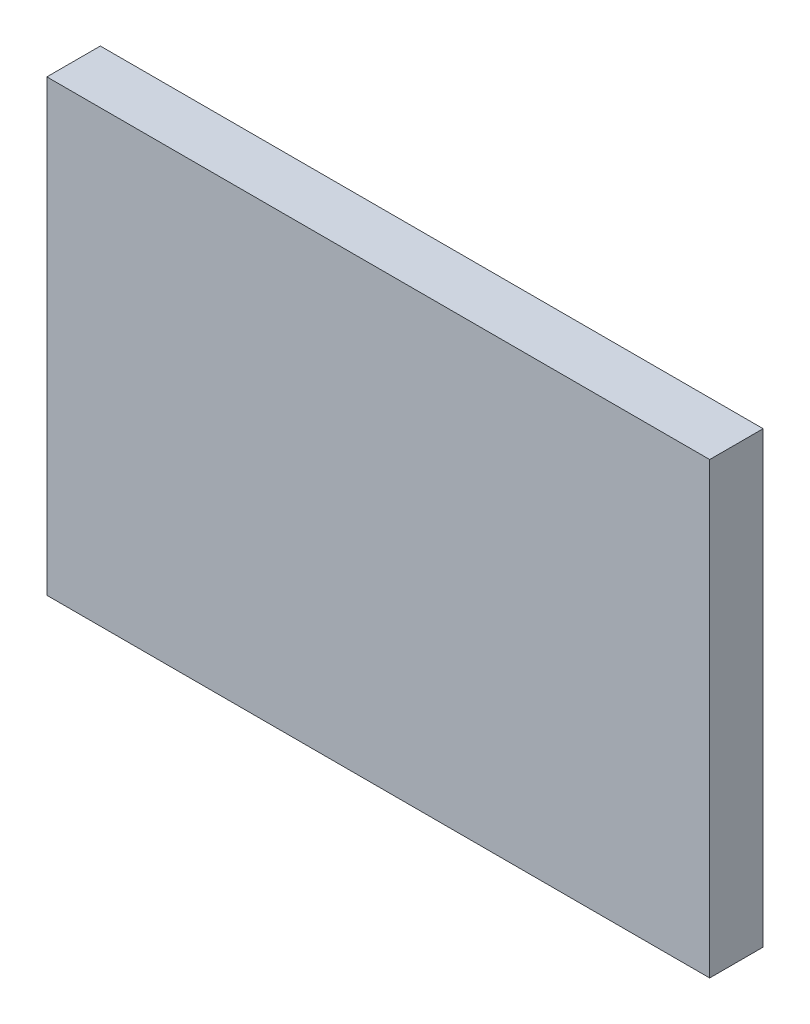
ISO-10303-21;
HEADER;
FILE_DESCRIPTION(('STEP AP214'),'2;1');
FILE_NAME('part.step','',(''),(''),'','','');
FILE_SCHEMA(('AUTOMOTIVE_DESIGN { 1 0 10303 214 1 1 1 1 }'));
ENDSEC;
DATA;
#1=APPLICATION_CONTEXT('core data for automotive mechanical design processes');
#2=APPLICATION_PROTOCOL_DEFINITION('international standard','automotive_design',2000,#1);
#3=PRODUCT_CONTEXT('',#1,'mechanical');
#4=PRODUCT('Part','Part','',(#3));
#5=PRODUCT_RELATED_PRODUCT_CATEGORY('part','',(#4));
#6=PRODUCT_DEFINITION_FORMATION('','',#4);
#7=PRODUCT_DEFINITION_CONTEXT('part definition',#1,'design');
#8=PRODUCT_DEFINITION('design','',#6,#7);
#9=PRODUCT_DEFINITION_SHAPE('','',#8);
#10=(LENGTH_UNIT() NAMED_UNIT(*) SI_UNIT(.MILLI.,.METRE.));
#11=(NAMED_UNIT(*) PLANE_ANGLE_UNIT() SI_UNIT($,.RADIAN.));
#12=(NAMED_UNIT(*) SI_UNIT($,.STERADIAN.) SOLID_ANGLE_UNIT());
#13=UNCERTAINTY_MEASURE_WITH_UNIT(LENGTH_MEASURE(1.E-05),#10,'distance_accuracy_value','');
#14=(GEOMETRIC_REPRESENTATION_CONTEXT(3) GLOBAL_UNCERTAINTY_ASSIGNED_CONTEXT((#13)) GLOBAL_UNIT_ASSIGNED_CONTEXT((#10,
#11,#12)) REPRESENTATION_CONTEXT('',''));
#15=CARTESIAN_POINT('',(0.,0.,0.));
#16=DIRECTION('',(0.,0.,1.));
#17=DIRECTION('',(1.,0.,0.));
#18=AXIS2_PLACEMENT_3D('',#15,#16,#17);
#19=CARTESIAN_POINT('',(-31.,21.,5.));
#20=DIRECTION('',(1.,0.,0.));
#21=DIRECTION('',(0.,0.,-1.));
#22=AXIS2_PLACEMENT_3D('',#19,#20,#21);
#23=PLANE('',#22);
#24=DIRECTION('',(0.,-1.,0.));
#25=VECTOR('',#24,1.);
#26=CARTESIAN_POINT('',(-31.,21.,0.));
#27=LINE('',#26,#25);
#28=CARTESIAN_POINT('',(-31.,21.,0.));
#29=VERTEX_POINT('',#28);
#30=CARTESIAN_POINT('',(-31.,-21.,0.));
#31=VERTEX_POINT('',#30);
#32=EDGE_CURVE('E96',#29,#31,#27,.T.);
#33=ORIENTED_EDGE('',*,*,#32,.T.);
#34=DIRECTION('',(0.,0.,-1.));
#35=VECTOR('',#34,1.);
#36=CARTESIAN_POINT('',(-31.,-21.,5.));
#37=LINE('',#36,#35);
#38=CARTESIAN_POINT('',(-31.,-21.,5.));
#39=VERTEX_POINT('',#38);
#40=EDGE_CURVE('E11',#39,#31,#37,.T.);
#41=ORIENTED_EDGE('',*,*,#40,.F.);
#42=DIRECTION('',(0.,-1.,0.));
#43=VECTOR('',#42,1.);
#44=CARTESIAN_POINT('',(-31.,21.,5.));
#45=LINE('',#44,#43);
#46=CARTESIAN_POINT('',(-31.,21.,5.));
#47=VERTEX_POINT('',#46);
#48=EDGE_CURVE('E84',#47,#39,#45,.T.);
#49=ORIENTED_EDGE('',*,*,#48,.F.);
#50=DIRECTION('',(0.,0.,-1.));
#51=VECTOR('',#50,1.);
#52=CARTESIAN_POINT('',(-31.,21.,5.));
#53=LINE('',#52,#51);
#54=EDGE_CURVE('E92',#47,#29,#53,.T.);
#55=ORIENTED_EDGE('',*,*,#54,.T.);
#56=EDGE_LOOP('',(#33,#41,#49,#55));
#57=FACE_BOUND('',#56,.T.);
#58=ADVANCED_FACE('F33',(#57),#23,.F.);
#59=CARTESIAN_POINT('',(31.,-21.,5.));
#60=DIRECTION('',(0.,1.,0.));
#61=DIRECTION('',(0.,0.,1.));
#62=AXIS2_PLACEMENT_3D('',#59,#60,#61);
#63=PLANE('',#62);
#64=DIRECTION('',(1.,0.,0.));
#65=VECTOR('',#64,1.);
#66=CARTESIAN_POINT('',(31.,-21.,0.));
#67=LINE('',#66,#65);
#68=CARTESIAN_POINT('',(31.,-21.,0.));
#69=VERTEX_POINT('',#68);
#70=EDGE_CURVE('E88',#31,#69,#67,.T.);
#71=ORIENTED_EDGE('',*,*,#70,.T.);
#72=DIRECTION('',(0.,0.,-1.));
#73=VECTOR('',#72,1.);
#74=CARTESIAN_POINT('',(31.,-21.,5.));
#75=LINE('',#74,#73);
#76=CARTESIAN_POINT('',(31.,-21.,5.));
#77=VERTEX_POINT('',#76);
#78=EDGE_CURVE('E41',#77,#69,#75,.T.);
#79=ORIENTED_EDGE('',*,*,#78,.F.);
#80=DIRECTION('',(1.,0.,0.));
#81=VECTOR('',#80,1.);
#82=CARTESIAN_POINT('',(31.,-21.,5.));
#83=LINE('',#82,#81);
#84=EDGE_CURVE('E79',#39,#77,#83,.T.);
#85=ORIENTED_EDGE('',*,*,#84,.F.);
#86=ORIENTED_EDGE('',*,*,#40,.T.);
#87=EDGE_LOOP('',(#71,#79,#85,#86));
#88=FACE_BOUND('',#87,.T.);
#89=ADVANCED_FACE('F87',(#88),#63,.F.);
#90=CARTESIAN_POINT('',(31.,21.,5.));
#91=DIRECTION('',(-1.,0.,0.));
#92=DIRECTION('',(0.,0.,1.));
#93=AXIS2_PLACEMENT_3D('',#90,#91,#92);
#94=PLANE('',#93);
#95=DIRECTION('',(0.,1.,0.));
#96=VECTOR('',#95,1.);
#97=CARTESIAN_POINT('',(31.,21.,0.));
#98=LINE('',#97,#96);
#99=CARTESIAN_POINT('',(31.,21.,0.));
#100=VERTEX_POINT('',#99);
#101=EDGE_CURVE('E66',#69,#100,#98,.T.);
#102=ORIENTED_EDGE('',*,*,#101,.T.);
#103=DIRECTION('',(0.,0.,-1.));
#104=VECTOR('',#103,1.);
#105=CARTESIAN_POINT('',(31.,21.,5.));
#106=LINE('',#105,#104);
#107=CARTESIAN_POINT('',(31.,21.,5.));
#108=VERTEX_POINT('',#107);
#109=EDGE_CURVE('E89',#108,#100,#106,.T.);
#110=ORIENTED_EDGE('',*,*,#109,.F.);
#111=DIRECTION('',(0.,1.,0.));
#112=VECTOR('',#111,1.);
#113=CARTESIAN_POINT('',(31.,21.,5.));
#114=LINE('',#113,#112);
#115=EDGE_CURVE('E82',#77,#108,#114,.T.);
#116=ORIENTED_EDGE('',*,*,#115,.F.);
#117=ORIENTED_EDGE('',*,*,#78,.T.);
#118=EDGE_LOOP('',(#102,#110,#116,#117));
#119=FACE_BOUND('',#118,.T.);
#120=ADVANCED_FACE('F90',(#119),#94,.F.);
#121=CARTESIAN_POINT('',(31.,21.,5.));
#122=DIRECTION('',(0.,-1.,0.));
#123=DIRECTION('',(0.,0.,-1.));
#124=AXIS2_PLACEMENT_3D('',#121,#122,#123);
#125=PLANE('',#124);
#126=DIRECTION('',(-1.,0.,0.));
#127=VECTOR('',#126,1.);
#128=CARTESIAN_POINT('',(31.,21.,0.));
#129=LINE('',#128,#127);
#130=EDGE_CURVE('E72',#100,#29,#129,.T.);
#131=ORIENTED_EDGE('',*,*,#130,.T.);
#132=ORIENTED_EDGE('',*,*,#54,.F.);
#133=DIRECTION('',(-1.,0.,0.));
#134=VECTOR('',#133,1.);
#135=CARTESIAN_POINT('',(31.,21.,5.));
#136=LINE('',#135,#134);
#137=EDGE_CURVE('E49',#108,#47,#136,.T.);
#138=ORIENTED_EDGE('',*,*,#137,.F.);
#139=ORIENTED_EDGE('',*,*,#109,.T.);
#140=EDGE_LOOP('',(#131,#132,#138,#139));
#141=FACE_BOUND('',#140,.T.);
#142=ADVANCED_FACE('F103',(#141),#125,.F.);
#143=CARTESIAN_POINT('',(0.,0.,5.));
#144=DIRECTION('',(0.,0.,-1.));
#145=DIRECTION('',(-1.,0.,0.));
#146=AXIS2_PLACEMENT_3D('',#143,#144,#145);
#147=PLANE('',#146);
#148=ORIENTED_EDGE('',*,*,#48,.T.);
#149=ORIENTED_EDGE('',*,*,#84,.T.);
#150=ORIENTED_EDGE('',*,*,#115,.T.);
#151=ORIENTED_EDGE('',*,*,#137,.T.);
#152=EDGE_LOOP('',(#148,#149,#150,#151));
#153=FACE_BOUND('',#152,.T.);
#154=ADVANCED_FACE('F80',(#153),#147,.F.);
#155=CARTESIAN_POINT('',(0.,0.,0.));
#156=DIRECTION('',(0.,0.,-1.));
#157=DIRECTION('',(-1.,0.,0.));
#158=AXIS2_PLACEMENT_3D('',#155,#156,#157);
#159=PLANE('',#158);
#160=ORIENTED_EDGE('',*,*,#32,.F.);
#161=ORIENTED_EDGE('',*,*,#130,.F.);
#162=ORIENTED_EDGE('',*,*,#101,.F.);
#163=ORIENTED_EDGE('',*,*,#70,.F.);
#164=EDGE_LOOP('',(#160,#161,#162,#163));
#165=FACE_BOUND('',#164,.T.);
#166=ADVANCED_FACE('F106',(#165),#159,.T.);
#167=CLOSED_SHELL('',(#58,#89,#120,#142,#154,#166));
#168=MANIFOLD_SOLID_BREP('B2',#167);
#169=ADVANCED_BREP_SHAPE_REPRESENTATION('',(#18,#168),#14);
#170=SHAPE_DEFINITION_REPRESENTATION(#9,#169);
ENDSEC;
END-ISO-10303-21;
